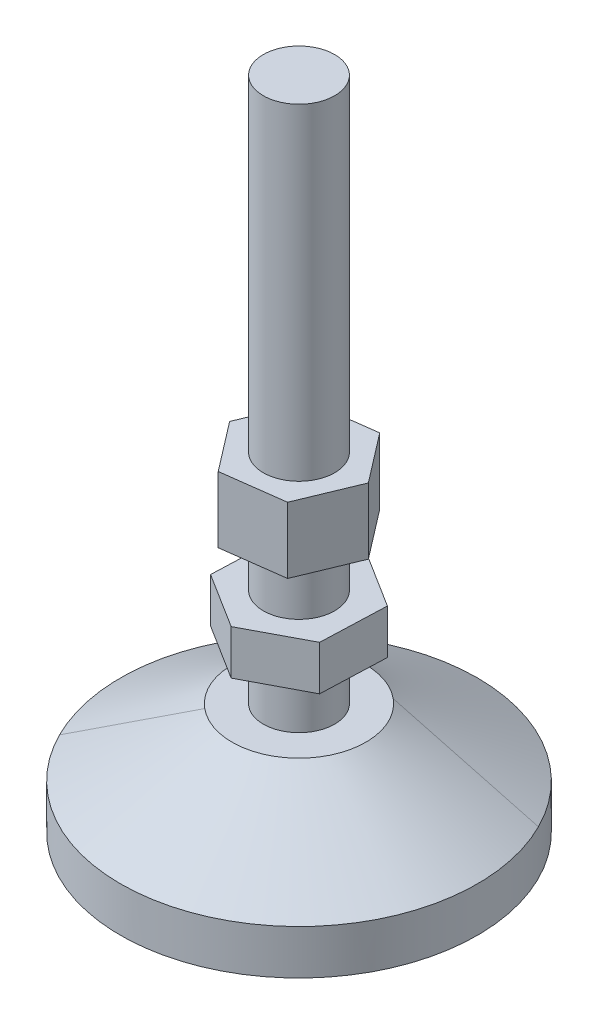
ISO-10303-21;
HEADER;
FILE_DESCRIPTION(('STEP AP214'),'2;1');
FILE_NAME('part.step','',(''),(''),'','','');
FILE_SCHEMA(('AUTOMOTIVE_DESIGN { 1 0 10303 214 1 1 1 1 }'));
ENDSEC;
DATA;
#1=APPLICATION_CONTEXT('core data for automotive mechanical design processes');
#2=APPLICATION_PROTOCOL_DEFINITION('international standard','automotive_design',2000,#1);
#3=PRODUCT_CONTEXT('',#1,'mechanical');
#4=PRODUCT('Part','Part','',(#3));
#5=PRODUCT_RELATED_PRODUCT_CATEGORY('part','',(#4));
#6=PRODUCT_DEFINITION_FORMATION('','',#4);
#7=PRODUCT_DEFINITION_CONTEXT('part definition',#1,'design');
#8=PRODUCT_DEFINITION('design','',#6,#7);
#9=PRODUCT_DEFINITION_SHAPE('','',#8);
#10=(LENGTH_UNIT() NAMED_UNIT(*) SI_UNIT(.MILLI.,.METRE.));
#11=(NAMED_UNIT(*) PLANE_ANGLE_UNIT() SI_UNIT($,.RADIAN.));
#12=(NAMED_UNIT(*) SI_UNIT($,.STERADIAN.) SOLID_ANGLE_UNIT());
#13=UNCERTAINTY_MEASURE_WITH_UNIT(LENGTH_MEASURE(1.E-05),#10,'distance_accuracy_value','');
#14=(GEOMETRIC_REPRESENTATION_CONTEXT(3) GLOBAL_UNCERTAINTY_ASSIGNED_CONTEXT((#13)) GLOBAL_UNIT_ASSIGNED_CONTEXT((#10,
#11,#12)) REPRESENTATION_CONTEXT('',''));
#15=CARTESIAN_POINT('',(0.,0.,0.));
#16=DIRECTION('',(0.,0.,1.));
#17=DIRECTION('',(1.,0.,0.));
#18=AXIS2_PLACEMENT_3D('',#15,#16,#17);
#19=CARTESIAN_POINT('',(0.,147.,0.));
#20=DIRECTION('',(0.,1.,0.));
#21=DIRECTION('',(0.,0.,-1.));
#22=AXIS2_PLACEMENT_3D('',#19,#20,#21);
#23=PLANE('',#22);
#24=CARTESIAN_POINT('',(0.,147.,0.));
#25=DIRECTION('',(0.,1.,0.));
#26=DIRECTION('',(0.,0.,1.));
#27=AXIS2_PLACEMENT_3D('',#24,#25,#26);
#28=CIRCLE('',#27,8.);
#29=CARTESIAN_POINT('',(0.,147.,-8.));
#30=VERTEX_POINT('',#29);
#31=EDGE_CURVE('E119',#30,#30,#28,.T.);
#32=ORIENTED_EDGE('',*,*,#31,.T.);
#33=EDGE_LOOP('',(#32));
#34=FACE_BOUND('',#33,.T.);
#35=ADVANCED_FACE('F16',(#34),#23,.T.);
#36=CARTESIAN_POINT('',(5.29971058692309,73.8,-12.8028538886787));
#37=DIRECTION('',(0.130751284506313,0.,0.991415201416616));
#38=DIRECTION('',(0.,-1.,0.));
#39=AXIS2_PLACEMENT_3D('',#36,#37,#38);
#40=PLANE('',#39);
#41=DIRECTION('',(-0.991415201416616,0.,0.130751284506313));
#42=VECTOR('',#41,1.);
#43=CARTESIAN_POINT('',(5.29971058692309,59.,-12.8028538886787));
#44=LINE('',#43,#42);
#45=CARTESIAN_POINT('',(5.29971058692309,59.,-12.8028538886787));
#46=VERTEX_POINT('',#45);
#47=CARTESIAN_POINT('',(-8.4377414150746,59.,-10.9911109453201));
#48=VERTEX_POINT('',#47);
#49=EDGE_CURVE('E238',#46,#48,#44,.T.);
#50=ORIENTED_EDGE('',*,*,#49,.T.);
#51=DIRECTION('',(0.,-1.,0.));
#52=VECTOR('',#51,1.);
#53=CARTESIAN_POINT('',(-8.4377414150746,73.8,-10.9911109453201));
#54=LINE('',#53,#52);
#55=CARTESIAN_POINT('',(-8.4377414150746,73.8,-10.9911109453201));
#56=VERTEX_POINT('',#55);
#57=EDGE_CURVE('E185',#56,#48,#54,.T.);
#58=ORIENTED_EDGE('',*,*,#57,.F.);
#59=DIRECTION('',(-0.991415201416616,0.,0.130751284506313));
#60=VECTOR('',#59,1.);
#61=CARTESIAN_POINT('',(5.29971058692309,73.8,-12.8028538886787));
#62=LINE('',#61,#60);
#63=CARTESIAN_POINT('',(5.29971058692309,73.8,-12.8028538886787));
#64=VERTEX_POINT('',#63);
#65=EDGE_CURVE('E175',#64,#56,#62,.T.);
#66=ORIENTED_EDGE('',*,*,#65,.F.);
#67=DIRECTION('',(0.,-1.,0.));
#68=VECTOR('',#67,1.);
#69=CARTESIAN_POINT('',(5.29971058692309,73.8,-12.8028538886787));
#70=LINE('',#69,#68);
#71=EDGE_CURVE('E11',#64,#46,#70,.T.);
#72=ORIENTED_EDGE('',*,*,#71,.T.);
#73=EDGE_LOOP('',(#50,#58,#66,#72));
#74=FACE_BOUND('',#73,.T.);
#75=ADVANCED_FACE('F427',(#74),#40,.F.);
#76=CARTESIAN_POINT('',(13.7374520019977,73.8,-1.81174294335863));
#77=DIRECTION('',(-0.793215107871699,0.,0.608941534668222));
#78=DIRECTION('',(0.,1.,0.));
#79=AXIS2_PLACEMENT_3D('',#76,#77,#78);
#80=PLANE('',#79);
#81=DIRECTION('',(-0.608941534668222,0.,-0.793215107871699));
#82=VECTOR('',#81,1.);
#83=CARTESIAN_POINT('',(13.7374520019977,59.,-1.81174294335863));
#84=LINE('',#83,#82);
#85=CARTESIAN_POINT('',(13.7374520019977,59.,-1.81174294335863));
#86=VERTEX_POINT('',#85);
#87=EDGE_CURVE('E234',#86,#46,#84,.T.);
#88=ORIENTED_EDGE('',*,*,#87,.T.);
#89=ORIENTED_EDGE('',*,*,#71,.F.);
#90=DIRECTION('',(-0.608941534668222,0.,-0.793215107871699));
#91=VECTOR('',#90,1.);
#92=CARTESIAN_POINT('',(13.7374520019977,73.8,-1.81174294335863));
#93=LINE('',#92,#91);
#94=CARTESIAN_POINT('',(13.7374520019977,73.8,-1.81174294335863));
#95=VERTEX_POINT('',#94);
#96=EDGE_CURVE('E180',#95,#64,#93,.T.);
#97=ORIENTED_EDGE('',*,*,#96,.F.);
#98=DIRECTION('',(0.,-1.,0.));
#99=VECTOR('',#98,1.);
#100=CARTESIAN_POINT('',(13.7374520019977,73.8,-1.81174294335863));
#101=LINE('',#100,#99);
#102=EDGE_CURVE('E27',#95,#86,#101,.T.);
#103=ORIENTED_EDGE('',*,*,#102,.T.);
#104=EDGE_LOOP('',(#88,#89,#97,#103));
#105=FACE_BOUND('',#104,.T.);
#106=ADVANCED_FACE('F18',(#105),#80,.F.);
#107=CARTESIAN_POINT('',(8.43774141507461,73.8,10.9911109453201));
#108=DIRECTION('',(-0.923966392378012,0.,-0.382473666748394));
#109=DIRECTION('',(-0.382473666748394,0.,0.923966392378012));
#110=AXIS2_PLACEMENT_3D('',#107,#108,#109);
#111=PLANE('',#110);
#112=DIRECTION('',(0.382473666748394,0.,-0.923966392378012));
#113=VECTOR('',#112,1.);
#114=CARTESIAN_POINT('',(8.43774141507461,59.,10.9911109453201));
#115=LINE('',#114,#113);
#116=CARTESIAN_POINT('',(8.43774141507461,59.,10.9911109453201));
#117=VERTEX_POINT('',#116);
#118=EDGE_CURVE('E209',#117,#86,#115,.T.);
#119=ORIENTED_EDGE('',*,*,#118,.T.);
#120=ORIENTED_EDGE('',*,*,#102,.F.);
#121=DIRECTION('',(0.382473666748394,0.,-0.923966392378012));
#122=VECTOR('',#121,1.);
#123=CARTESIAN_POINT('',(8.43774141507461,73.8,10.9911109453201));
#124=LINE('',#123,#122);
#125=CARTESIAN_POINT('',(8.43774141507461,73.8,10.9911109453201));
#126=VERTEX_POINT('',#125);
#127=EDGE_CURVE('E173',#126,#95,#124,.T.);
#128=ORIENTED_EDGE('',*,*,#127,.F.);
#129=DIRECTION('',(0.,-1.,0.));
#130=VECTOR('',#129,1.);
#131=CARTESIAN_POINT('',(8.43774141507461,73.8,10.9911109453201));
#132=LINE('',#131,#130);
#133=EDGE_CURVE('E233',#126,#117,#132,.T.);
#134=ORIENTED_EDGE('',*,*,#133,.T.);
#135=EDGE_LOOP('',(#119,#120,#128,#134));
#136=FACE_BOUND('',#135,.T.);
#137=ADVANCED_FACE('F616',(#136),#111,.F.);
#138=CARTESIAN_POINT('',(-5.29971058692308,73.8,12.8028538886787));
#139=DIRECTION('',(-0.130751284506313,0.,-0.991415201416616));
#140=DIRECTION('',(-0.991415201416616,0.,0.130751284506313));
#141=AXIS2_PLACEMENT_3D('',#138,#139,#140);
#142=PLANE('',#141);
#143=DIRECTION('',(0.991415201416616,0.,-0.130751284506313));
#144=VECTOR('',#143,1.);
#145=CARTESIAN_POINT('',(-5.29971058692308,59.,12.8028538886787));
#146=LINE('',#145,#144);
#147=CARTESIAN_POINT('',(-5.29971058692308,59.,12.8028538886787));
#148=VERTEX_POINT('',#147);
#149=EDGE_CURVE('E220',#148,#117,#146,.T.);
#150=ORIENTED_EDGE('',*,*,#149,.T.);
#151=ORIENTED_EDGE('',*,*,#133,.F.);
#152=DIRECTION('',(0.991415201416616,0.,-0.130751284506313));
#153=VECTOR('',#152,1.);
#154=CARTESIAN_POINT('',(-5.29971058692308,73.8,12.8028538886787));
#155=LINE('',#154,#153);
#156=CARTESIAN_POINT('',(-5.29971058692308,73.8,12.8028538886787));
#157=VERTEX_POINT('',#156);
#158=EDGE_CURVE('E169',#157,#126,#155,.T.);
#159=ORIENTED_EDGE('',*,*,#158,.F.);
#160=DIRECTION('',(0.,-1.,0.));
#161=VECTOR('',#160,1.);
#162=CARTESIAN_POINT('',(-5.29971058692308,73.8,12.8028538886787));
#163=LINE('',#162,#161);
#164=EDGE_CURVE('E42',#157,#148,#163,.T.);
#165=ORIENTED_EDGE('',*,*,#164,.T.);
#166=EDGE_LOOP('',(#150,#151,#159,#165));
#167=FACE_BOUND('',#166,.T.);
#168=ADVANCED_FACE('F620',(#167),#142,.F.);
#169=CARTESIAN_POINT('',(-13.7374520019977,73.8,1.81174294335863));
#170=DIRECTION('',(0.793215107871699,0.,-0.608941534668222));
#171=DIRECTION('',(0.,-1.,0.));
#172=AXIS2_PLACEMENT_3D('',#169,#170,#171);
#173=PLANE('',#172);
#174=DIRECTION('',(0.608941534668222,0.,0.793215107871699));
#175=VECTOR('',#174,1.);
#176=CARTESIAN_POINT('',(-13.7374520019977,59.,1.81174294335863));
#177=LINE('',#176,#175);
#178=CARTESIAN_POINT('',(-13.7374520019977,59.,1.81174294335863));
#179=VERTEX_POINT('',#178);
#180=EDGE_CURVE('E212',#179,#148,#177,.T.);
#181=ORIENTED_EDGE('',*,*,#180,.T.);
#182=ORIENTED_EDGE('',*,*,#164,.F.);
#183=DIRECTION('',(0.608941534668222,0.,0.793215107871699));
#184=VECTOR('',#183,1.);
#185=CARTESIAN_POINT('',(-13.7374520019977,73.8,1.81174294335863));
#186=LINE('',#185,#184);
#187=CARTESIAN_POINT('',(-13.7374520019977,73.8,1.81174294335863));
#188=VERTEX_POINT('',#187);
#189=EDGE_CURVE('E174',#188,#157,#186,.T.);
#190=ORIENTED_EDGE('',*,*,#189,.F.);
#191=DIRECTION('',(0.,-1.,0.));
#192=VECTOR('',#191,1.);
#193=CARTESIAN_POINT('',(-13.7374520019977,73.8,1.81174294335863));
#194=LINE('',#193,#192);
#195=EDGE_CURVE('E188',#188,#179,#194,.T.);
#196=ORIENTED_EDGE('',*,*,#195,.T.);
#197=EDGE_LOOP('',(#181,#182,#190,#196));
#198=FACE_BOUND('',#197,.T.);
#199=ADVANCED_FACE('F630',(#198),#173,.F.);
#200=CARTESIAN_POINT('',(-8.4377414150746,73.8,-10.9911109453201));
#201=DIRECTION('',(0.923966392378012,0.,0.382473666748394));
#202=DIRECTION('',(0.,-1.,0.));
#203=AXIS2_PLACEMENT_3D('',#200,#201,#202);
#204=PLANE('',#203);
#205=DIRECTION('',(-0.382473666748394,0.,0.923966392378012));
#206=VECTOR('',#205,1.);
#207=CARTESIAN_POINT('',(-8.4377414150746,59.,-10.9911109453201));
#208=LINE('',#207,#206);
#209=EDGE_CURVE('E179',#48,#179,#208,.T.);
#210=ORIENTED_EDGE('',*,*,#209,.T.);
#211=ORIENTED_EDGE('',*,*,#195,.F.);
#212=DIRECTION('',(-0.382473666748394,0.,0.923966392378012));
#213=VECTOR('',#212,1.);
#214=CARTESIAN_POINT('',(-8.4377414150746,73.8,-10.9911109453201));
#215=LINE('',#214,#213);
#216=EDGE_CURVE('E239',#56,#188,#215,.T.);
#217=ORIENTED_EDGE('',*,*,#216,.F.);
#218=ORIENTED_EDGE('',*,*,#57,.T.);
#219=EDGE_LOOP('',(#210,#211,#217,#218));
#220=FACE_BOUND('',#219,.T.);
#221=ADVANCED_FACE('F603',(#220),#204,.F.);
#222=CARTESIAN_POINT('',(0.,59.,0.));
#223=DIRECTION('',(0.,1.,0.));
#224=DIRECTION('',(1.,0.,0.));
#225=AXIS2_PLACEMENT_3D('',#222,#223,#224);
#226=PLANE('',#225);
#227=CARTESIAN_POINT('',(0.,59.,0.));
#228=DIRECTION('',(0.,1.,0.));
#229=DIRECTION('',(0.,0.,1.));
#230=AXIS2_PLACEMENT_3D('',#227,#228,#229);
#231=CIRCLE('',#230,8.);
#232=CARTESIAN_POINT('',(0.,59.,-8.));
#233=VERTEX_POINT('',#232);
#234=EDGE_CURVE('E144',#233,#233,#231,.T.);
#235=ORIENTED_EDGE('',*,*,#234,.T.);
#236=EDGE_LOOP('',(#235));
#237=FACE_BOUND('',#236,.T.);
#238=ORIENTED_EDGE('',*,*,#209,.F.);
#239=ORIENTED_EDGE('',*,*,#49,.F.);
#240=ORIENTED_EDGE('',*,*,#87,.F.);
#241=ORIENTED_EDGE('',*,*,#118,.F.);
#242=ORIENTED_EDGE('',*,*,#149,.F.);
#243=ORIENTED_EDGE('',*,*,#180,.F.);
#244=EDGE_LOOP('',(#238,#239,#240,#241,#242,#243));
#245=FACE_BOUND('',#244,.T.);
#246=ADVANCED_FACE('F599',(#237,#245),#226,.F.);
#247=CARTESIAN_POINT('',(0.,73.8,0.));
#248=DIRECTION('',(0.,1.,0.));
#249=DIRECTION('',(1.,0.,0.));
#250=AXIS2_PLACEMENT_3D('',#247,#248,#249);
#251=PLANE('',#250);
#252=CARTESIAN_POINT('',(0.,73.8,0.));
#253=DIRECTION('',(0.,1.,0.));
#254=DIRECTION('',(0.,0.,1.));
#255=AXIS2_PLACEMENT_3D('',#252,#253,#254);
#256=CIRCLE('',#255,8.);
#257=CARTESIAN_POINT('',(0.,73.8,-8.));
#258=VERTEX_POINT('',#257);
#259=EDGE_CURVE('E113',#258,#258,#256,.T.);
#260=ORIENTED_EDGE('',*,*,#259,.F.);
#261=EDGE_LOOP('',(#260));
#262=FACE_BOUND('',#261,.T.);
#263=ORIENTED_EDGE('',*,*,#216,.T.);
#264=ORIENTED_EDGE('',*,*,#189,.T.);
#265=ORIENTED_EDGE('',*,*,#158,.T.);
#266=ORIENTED_EDGE('',*,*,#127,.T.);
#267=ORIENTED_EDGE('',*,*,#96,.T.);
#268=ORIENTED_EDGE('',*,*,#65,.T.);
#269=EDGE_LOOP('',(#263,#264,#265,#266,#267,#268));
#270=FACE_BOUND('',#269,.T.);
#271=ADVANCED_FACE('F443',(#262,#270),#251,.T.);
#272=CARTESIAN_POINT('',(0.,37.,0.));
#273=DIRECTION('',(0.,1.,0.));
#274=DIRECTION('',(1.,0.,0.));
#275=AXIS2_PLACEMENT_3D('',#272,#273,#274);
#276=PLANE('',#275);
#277=CARTESIAN_POINT('',(0.,37.,0.));
#278=DIRECTION('',(0.,1.,0.));
#279=DIRECTION('',(0.,0.,1.));
#280=AXIS2_PLACEMENT_3D('',#277,#278,#279);
#281=CIRCLE('',#280,8.);
#282=CARTESIAN_POINT('',(0.,37.,-8.));
#283=VERTEX_POINT('',#282);
#284=EDGE_CURVE('E145',#283,#283,#281,.T.);
#285=ORIENTED_EDGE('',*,*,#284,.T.);
#286=EDGE_LOOP('',(#285));
#287=FACE_BOUND('',#286,.T.);
#288=DIRECTION('',(-0.884080626307763,0.,0.467334405096901));
#289=VECTOR('',#288,1.);
#290=CARTESIAN_POINT('',(0.547240237587684,37.,-14.6544826403288));
#291=LINE('',#290,#289);
#292=CARTESIAN_POINT('',(0.547240237587684,37.,-14.6544826403288));
#293=VERTEX_POINT('',#292);
#294=CARTESIAN_POINT('',(-12.417534127049,37.,-7.80116526788837));
#295=VERTEX_POINT('',#294);
#296=EDGE_CURVE('E155',#293,#295,#291,.T.);
#297=ORIENTED_EDGE('',*,*,#296,.F.);
#298=DIRECTION('',(-0.846763780030285,0.,-0.53196907882773));
#299=VECTOR('',#298,1.);
#300=CARTESIAN_POINT('',(12.9647743646366,37.,-6.85331737244044));
#301=LINE('',#300,#299);
#302=CARTESIAN_POINT('',(12.9647743646366,37.,-6.85331737244044));
#303=VERTEX_POINT('',#302);
#304=EDGE_CURVE('E272',#303,#293,#301,.T.);
#305=ORIENTED_EDGE('',*,*,#304,.F.);
#306=DIRECTION('',(0.0373168462774775,0.,-0.99930348392463));
#307=VECTOR('',#306,1.);
#308=CARTESIAN_POINT('',(12.417534127049,37.,7.80116526788837));
#309=LINE('',#308,#307);
#310=CARTESIAN_POINT('',(12.417534127049,37.,7.80116526788837));
#311=VERTEX_POINT('',#310);
#312=EDGE_CURVE('E162',#311,#303,#309,.T.);
#313=ORIENTED_EDGE('',*,*,#312,.F.);
#314=DIRECTION('',(0.884080626307763,0.,-0.467334405096901));
#315=VECTOR('',#314,1.);
#316=CARTESIAN_POINT('',(-0.547240237587677,37.,14.6544826403288));
#317=LINE('',#316,#315);
#318=CARTESIAN_POINT('',(-0.547240237587677,37.,14.6544826403288));
#319=VERTEX_POINT('',#318);
#320=EDGE_CURVE('E326',#319,#311,#317,.T.);
#321=ORIENTED_EDGE('',*,*,#320,.F.);
#322=DIRECTION('',(0.846763780030285,0.,0.531969078827729));
#323=VECTOR('',#322,1.);
#324=CARTESIAN_POINT('',(-12.9647743646366,37.,6.85331737244044));
#325=LINE('',#324,#323);
#326=CARTESIAN_POINT('',(-12.9647743646366,37.,6.85331737244044));
#327=VERTEX_POINT('',#326);
#328=EDGE_CURVE('E146',#327,#319,#325,.T.);
#329=ORIENTED_EDGE('',*,*,#328,.F.);
#330=DIRECTION('',(-0.0373168462774774,0.,0.99930348392463));
#331=VECTOR('',#330,1.);
#332=CARTESIAN_POINT('',(-12.417534127049,37.,-7.80116526788837));
#333=LINE('',#332,#331);
#334=EDGE_CURVE('E191',#295,#327,#333,.T.);
#335=ORIENTED_EDGE('',*,*,#334,.F.);
#336=EDGE_LOOP('',(#297,#305,#313,#321,#329,#335));
#337=FACE_BOUND('',#336,.T.);
#338=ADVANCED_FACE('F410',(#287,#337),#276,.F.);
#339=CARTESIAN_POINT('',(0.,47.,0.));
#340=DIRECTION('',(0.,1.,0.));
#341=DIRECTION('',(1.,0.,0.));
#342=AXIS2_PLACEMENT_3D('',#339,#340,#341);
#343=PLANE('',#342);
#344=CARTESIAN_POINT('',(0.,47.,0.));
#345=DIRECTION('',(0.,1.,0.));
#346=DIRECTION('',(0.,0.,1.));
#347=AXIS2_PLACEMENT_3D('',#344,#345,#346);
#348=CIRCLE('',#347,8.);
#349=CARTESIAN_POINT('',(0.,47.,-8.));
#350=VERTEX_POINT('',#349);
#351=EDGE_CURVE('E168',#350,#350,#348,.T.);
#352=ORIENTED_EDGE('',*,*,#351,.F.);
#353=EDGE_LOOP('',(#352));
#354=FACE_BOUND('',#353,.T.);
#355=DIRECTION('',(-0.884080626307763,0.,0.467334405096901));
#356=VECTOR('',#355,1.);
#357=CARTESIAN_POINT('',(0.547240237587684,47.,-14.6544826403288));
#358=LINE('',#357,#356);
#359=CARTESIAN_POINT('',(0.547240237587684,47.,-14.6544826403288));
#360=VERTEX_POINT('',#359);
#361=CARTESIAN_POINT('',(-12.417534127049,47.,-7.80116526788837));
#362=VERTEX_POINT('',#361);
#363=EDGE_CURVE('E136',#360,#362,#358,.T.);
#364=ORIENTED_EDGE('',*,*,#363,.T.);
#365=DIRECTION('',(-0.0373168462774774,0.,0.99930348392463));
#366=VECTOR('',#365,1.);
#367=CARTESIAN_POINT('',(-12.417534127049,47.,-7.80116526788837));
#368=LINE('',#367,#366);
#369=CARTESIAN_POINT('',(-12.9647743646366,47.,6.85331737244044));
#370=VERTEX_POINT('',#369);
#371=EDGE_CURVE('E151',#362,#370,#368,.T.);
#372=ORIENTED_EDGE('',*,*,#371,.T.);
#373=DIRECTION('',(0.846763780030285,0.,0.531969078827729));
#374=VECTOR('',#373,1.);
#375=CARTESIAN_POINT('',(-12.9647743646366,47.,6.85331737244044));
#376=LINE('',#375,#374);
#377=CARTESIAN_POINT('',(-0.547240237587677,47.,14.6544826403288));
#378=VERTEX_POINT('',#377);
#379=EDGE_CURVE('E20',#370,#378,#376,.T.);
#380=ORIENTED_EDGE('',*,*,#379,.T.);
#381=DIRECTION('',(0.884080626307763,0.,-0.467334405096901));
#382=VECTOR('',#381,1.);
#383=CARTESIAN_POINT('',(-0.547240237587677,47.,14.6544826403288));
#384=LINE('',#383,#382);
#385=CARTESIAN_POINT('',(12.417534127049,47.,7.80116526788837));
#386=VERTEX_POINT('',#385);
#387=EDGE_CURVE('E159',#378,#386,#384,.T.);
#388=ORIENTED_EDGE('',*,*,#387,.T.);
#389=DIRECTION('',(0.0373168462774775,0.,-0.99930348392463));
#390=VECTOR('',#389,1.);
#391=CARTESIAN_POINT('',(12.417534127049,47.,7.80116526788837));
#392=LINE('',#391,#390);
#393=CARTESIAN_POINT('',(12.9647743646366,47.,-6.85331737244044));
#394=VERTEX_POINT('',#393);
#395=EDGE_CURVE('E280',#386,#394,#392,.T.);
#396=ORIENTED_EDGE('',*,*,#395,.T.);
#397=DIRECTION('',(-0.846763780030285,0.,-0.53196907882773));
#398=VECTOR('',#397,1.);
#399=CARTESIAN_POINT('',(12.9647743646366,47.,-6.85331737244044));
#400=LINE('',#399,#398);
#401=EDGE_CURVE('E242',#394,#360,#400,.T.);
#402=ORIENTED_EDGE('',*,*,#401,.T.);
#403=EDGE_LOOP('',(#364,#372,#380,#388,#396,#402));
#404=FACE_BOUND('',#403,.T.);
#405=ADVANCED_FACE('F341',(#354,#404),#343,.T.);
#406=CARTESIAN_POINT('',(12.9647743646366,47.,-6.85331737244044));
#407=DIRECTION('',(-0.53196907882773,0.,0.846763780030285));
#408=DIRECTION('',(0.,1.,0.));
#409=AXIS2_PLACEMENT_3D('',#406,#407,#408);
#410=PLANE('',#409);
#411=ORIENTED_EDGE('',*,*,#304,.T.);
#412=DIRECTION('',(0.,-1.,0.));
#413=VECTOR('',#412,1.);
#414=CARTESIAN_POINT('',(0.547240237587684,47.,-14.6544826403288));
#415=LINE('',#414,#413);
#416=EDGE_CURVE('E139',#360,#293,#415,.T.);
#417=ORIENTED_EDGE('',*,*,#416,.F.);
#418=ORIENTED_EDGE('',*,*,#401,.F.);
#419=DIRECTION('',(0.,-1.,0.));
#420=VECTOR('',#419,1.);
#421=CARTESIAN_POINT('',(12.9647743646366,47.,-6.85331737244044));
#422=LINE('',#421,#420);
#423=EDGE_CURVE('E284',#394,#303,#422,.T.);
#424=ORIENTED_EDGE('',*,*,#423,.T.);
#425=EDGE_LOOP('',(#411,#417,#418,#424));
#426=FACE_BOUND('',#425,.T.);
#427=ADVANCED_FACE('F409',(#426),#410,.F.);
#428=CARTESIAN_POINT('',(12.417534127049,47.,7.80116526788837));
#429=DIRECTION('',(-0.99930348392463,0.,-0.0373168462774775));
#430=DIRECTION('',(-0.0373168462774775,0.,0.99930348392463));
#431=AXIS2_PLACEMENT_3D('',#428,#429,#430);
#432=PLANE('',#431);
#433=ORIENTED_EDGE('',*,*,#312,.T.);
#434=ORIENTED_EDGE('',*,*,#423,.F.);
#435=ORIENTED_EDGE('',*,*,#395,.F.);
#436=DIRECTION('',(0.,-1.,0.));
#437=VECTOR('',#436,1.);
#438=CARTESIAN_POINT('',(12.417534127049,47.,7.80116526788837));
#439=LINE('',#438,#437);
#440=EDGE_CURVE('E163',#386,#311,#439,.T.);
#441=ORIENTED_EDGE('',*,*,#440,.T.);
#442=EDGE_LOOP('',(#433,#434,#435,#441));
#443=FACE_BOUND('',#442,.T.);
#444=ADVANCED_FACE('F414',(#443),#432,.F.);
#445=CARTESIAN_POINT('',(-0.547240237587677,47.,14.6544826403288));
#446=DIRECTION('',(-0.467334405096901,0.,-0.884080626307763));
#447=DIRECTION('',(-0.884080626307763,0.,0.467334405096901));
#448=AXIS2_PLACEMENT_3D('',#445,#446,#447);
#449=PLANE('',#448);
#450=ORIENTED_EDGE('',*,*,#320,.T.);
#451=ORIENTED_EDGE('',*,*,#440,.F.);
#452=ORIENTED_EDGE('',*,*,#387,.F.);
#453=DIRECTION('',(0.,-1.,0.));
#454=VECTOR('',#453,1.);
#455=CARTESIAN_POINT('',(-0.547240237587677,47.,14.6544826403288));
#456=LINE('',#455,#454);
#457=EDGE_CURVE('E150',#378,#319,#456,.T.);
#458=ORIENTED_EDGE('',*,*,#457,.T.);
#459=EDGE_LOOP('',(#450,#451,#452,#458));
#460=FACE_BOUND('',#459,.T.);
#461=ADVANCED_FACE('F345',(#460),#449,.F.);
#462=CARTESIAN_POINT('',(-12.9647743646366,47.,6.85331737244044));
#463=DIRECTION('',(0.531969078827729,0.,-0.846763780030285));
#464=DIRECTION('',(0.,-1.,0.));
#465=AXIS2_PLACEMENT_3D('',#462,#463,#464);
#466=PLANE('',#465);
#467=ORIENTED_EDGE('',*,*,#328,.T.);
#468=ORIENTED_EDGE('',*,*,#457,.F.);
#469=ORIENTED_EDGE('',*,*,#379,.F.);
#470=DIRECTION('',(0.,-1.,0.));
#471=VECTOR('',#470,1.);
#472=CARTESIAN_POINT('',(-12.9647743646366,47.,6.85331737244044));
#473=LINE('',#472,#471);
#474=EDGE_CURVE('E184',#370,#327,#473,.T.);
#475=ORIENTED_EDGE('',*,*,#474,.T.);
#476=EDGE_LOOP('',(#467,#468,#469,#475));
#477=FACE_BOUND('',#476,.T.);
#478=ADVANCED_FACE('F344',(#477),#466,.F.);
#479=CARTESIAN_POINT('',(-12.417534127049,47.,-7.80116526788837));
#480=DIRECTION('',(0.99930348392463,0.,0.0373168462774774));
#481=DIRECTION('',(0.,-1.,0.));
#482=AXIS2_PLACEMENT_3D('',#479,#480,#481);
#483=PLANE('',#482);
#484=ORIENTED_EDGE('',*,*,#334,.T.);
#485=ORIENTED_EDGE('',*,*,#474,.F.);
#486=ORIENTED_EDGE('',*,*,#371,.F.);
#487=DIRECTION('',(0.,-1.,0.));
#488=VECTOR('',#487,1.);
#489=CARTESIAN_POINT('',(-12.417534127049,47.,-7.80116526788837));
#490=LINE('',#489,#488);
#491=EDGE_CURVE('E140',#362,#295,#490,.T.);
#492=ORIENTED_EDGE('',*,*,#491,.T.);
#493=EDGE_LOOP('',(#484,#485,#486,#492));
#494=FACE_BOUND('',#493,.T.);
#495=ADVANCED_FACE('F413',(#494),#483,.F.);
#496=CARTESIAN_POINT('',(0.547240237587684,47.,-14.6544826403288));
#497=DIRECTION('',(0.467334405096901,0.,0.884080626307763));
#498=DIRECTION('',(0.,-1.,0.));
#499=AXIS2_PLACEMENT_3D('',#496,#497,#498);
#500=PLANE('',#499);
#501=ORIENTED_EDGE('',*,*,#296,.T.);
#502=ORIENTED_EDGE('',*,*,#491,.F.);
#503=ORIENTED_EDGE('',*,*,#363,.F.);
#504=ORIENTED_EDGE('',*,*,#416,.T.);
#505=EDGE_LOOP('',(#501,#502,#503,#504));
#506=FACE_BOUND('',#505,.T.);
#507=ADVANCED_FACE('F412',(#506),#500,.F.);
#508=CARTESIAN_POINT('',(9.59513522117862,25.,-11.529673893363));
#509=CARTESIAN_POINT('',(35.7610540048334,10.,-17.9205752269115));
#510=CARTESIAN_POINT('',(9.59596431310563,25.,-11.5289839129504));
#511=CARTESIAN_POINT('',(35.762342662638,10.,-17.9180036709897));
#512=CARTESIAN_POINT('',(9.59679330080092,25.,-11.5282938679148));
#513=CARTESIAN_POINT('',(35.7636309967342,10.,-17.9154320685208));
#514=CARTESIAN_POINT('',(9.59762218426767,25.,-11.5276037582861));
#515=CARTESIAN_POINT('',(35.7649190071616,10.,-17.9128604195748));
#516=CARTESIAN_POINT('',(32.65282970084,25.,7.66764061024918));
#517=CARTESIAN_POINT('',(71.5906398463112,10.,53.6169775947483));
#518=CARTESIAN_POINT('',(13.4575853323046,25.,30.7228481268215));
#519=CARTESIAN_POINT('',(0.0608018319881026,10.,89.442698433898));
#520=CARTESIAN_POINT('',(-9.59762218426767,25.,11.5276037582861));
#521=CARTESIAN_POINT('',(-35.7649190071616,10.,17.9128604195748));
#522=CARTESIAN_POINT('',(-9.59845106773245,25.,11.5269136486592));
#523=CARTESIAN_POINT('',(-35.7662070175859,10.,17.910288770635));
#524=CARTESIAN_POINT('',(-9.59927990656034,25.,11.5262234248245));
#525=CARTESIAN_POINT('',(-35.7674947969417,10.,17.9077168903321));
#526=CARTESIAN_POINT('',(-9.60010870072246,25.,11.5255330867736));
#527=CARTESIAN_POINT('',(-35.7687823451491,10.,17.9051447786762));
#528=(BOUNDED_SURFACE() B_SPLINE_SURFACE(3,1,((#508,#509),(#510,#511),(#512,#513),(#514,#515),
(#516,#517),(#518,#519),(#520,#521),(#522,#523),(#524,#525),(#526,#527)),.UNSPECIFIED.,.F.,.F.,
.F.) B_SPLINE_SURFACE_WITH_KNOTS((4,3,3,4),(2,2),(0.499946075705225,0.5,1.,1.00005392429465),
(0.,1.),
.UNSPECIFIED.) GEOMETRIC_REPRESENTATION_ITEM() RATIONAL_B_SPLINE_SURFACE(((0.999784326083537,
0.999784326083537),(0.999856209634813,0.999856209634813),(0.9999281009403,0.9999281009403),(1.,
1.),(0.333333333333334,0.333333333333334),(0.333333333333334,0.333333333333334),(1.,1.),
(0.999928100940472,0.999928100940472),(0.999856209635156,0.999856209635156),(0.999784326084052,0.999784326084052))) REPRESENTATION_ITEM('') SURFACE());
#529=CARTESIAN_POINT('',(9.59762147793056,25.,-11.5276029099362));
#530=CARTESIAN_POINT('',(35.7649190071616,10.,-17.9128604195748));
#531=(BOUNDED_CURVE() B_SPLINE_CURVE(1,(#529,#530),.UNSPECIFIED.,.F.,
.F.) B_SPLINE_CURVE_WITH_KNOTS((2,2),(0.,1.),
.UNSPECIFIED.) CURVE() GEOMETRIC_REPRESENTATION_ITEM() RATIONAL_B_SPLINE_CURVE((1.,1.)) REPRESENTATION_ITEM(''));
#532=CARTESIAN_POINT('',(9.59762147793056,25.,-11.5276029099362));
#533=VERTEX_POINT('',#532);
#534=CARTESIAN_POINT('',(35.7649190071616,10.,-17.9128604195748));
#535=VERTEX_POINT('',#534);
#536=EDGE_CURVE('E127',#533,#535,#531,.T.);
#537=CARTESIAN_POINT('',(0.,25.,0.));
#538=DIRECTION('',(0.,1.,0.));
#539=DIRECTION('',(0.,0.,1.));
#540=AXIS2_PLACEMENT_3D('',#537,#538,#539);
#541=CIRCLE('',#540,15.);
#542=CARTESIAN_POINT('',(-9.59762147793648,25.,11.5276029099312));
#543=VERTEX_POINT('',#542);
#544=EDGE_CURVE('E165',#543,#533,#541,.T.);
#545=CARTESIAN_POINT('',(-9.59762147793648,25.,11.5276029099312));
#546=CARTESIAN_POINT('',(-35.7649190071616,10.,17.9128604195748));
#547=(BOUNDED_CURVE() B_SPLINE_CURVE(1,(#545,#546),.UNSPECIFIED.,.F.,
.F.) B_SPLINE_CURVE_WITH_KNOTS((2,2),(0.,1.),
.UNSPECIFIED.) CURVE() GEOMETRIC_REPRESENTATION_ITEM() RATIONAL_B_SPLINE_CURVE((1.,1.)) REPRESENTATION_ITEM(''));
#548=CARTESIAN_POINT('',(-35.7649190071616,10.,17.9128604195748));
#549=VERTEX_POINT('',#548);
#550=EDGE_CURVE('E275',#543,#549,#547,.T.);
#551=CARTESIAN_POINT('',(0.,10.,0.));
#552=DIRECTION('',(0.,1.,0.));
#553=DIRECTION('',(0.,0.,-1.));
#554=AXIS2_PLACEMENT_3D('',#551,#552,#553);
#555=CIRCLE('',#554,40.);
#556=EDGE_CURVE('E268',#549,#535,#555,.T.);
#557=ORIENTED_EDGE('',*,*,#536,.F.);
#558=ORIENTED_EDGE('',*,*,#544,.F.);
#559=ORIENTED_EDGE('',*,*,#550,.T.);
#560=ORIENTED_EDGE('',*,*,#556,.T.);
#561=EDGE_LOOP('',(#557,#558,#559,#560));
#562=FACE_BOUND('',#561,.T.);
#563=ADVANCED_FACE('F572',(#562),#528,.T.);
#564=CARTESIAN_POINT('',(0.,25.,0.));
#565=DIRECTION('',(0.,1.,0.));
#566=DIRECTION('',(1.,0.,0.));
#567=AXIS2_PLACEMENT_3D('',#564,#565,#566);
#568=PLANE('',#567);
#569=CARTESIAN_POINT('',(0.,25.,0.));
#570=DIRECTION('',(0.,1.,0.));
#571=DIRECTION('',(0.,0.,1.));
#572=AXIS2_PLACEMENT_3D('',#569,#570,#571);
#573=CIRCLE('',#572,8.);
#574=CARTESIAN_POINT('',(0.,25.,-8.));
#575=VERTEX_POINT('',#574);
#576=EDGE_CURVE('E141',#575,#575,#573,.T.);
#577=ORIENTED_EDGE('',*,*,#576,.F.);
#578=EDGE_LOOP('',(#577));
#579=FACE_BOUND('',#578,.T.);
#580=ORIENTED_EDGE('',*,*,#544,.T.);
#581=CARTESIAN_POINT('',(0.,25.,0.));
#582=DIRECTION('',(0.,1.,0.));
#583=DIRECTION('',(0.,0.,1.));
#584=AXIS2_PLACEMENT_3D('',#581,#582,#583);
#585=CIRCLE('',#584,15.);
#586=EDGE_CURVE('E118',#533,#543,#585,.T.);
#587=ORIENTED_EDGE('',*,*,#586,.T.);
#588=EDGE_LOOP('',(#580,#587));
#589=FACE_BOUND('',#588,.T.);
#590=ADVANCED_FACE('F568',(#579,#589),#568,.T.);
#591=CARTESIAN_POINT('',(0.,0.,0.));
#592=DIRECTION('',(0.,1.,0.));
#593=DIRECTION('',(1.,0.,0.));
#594=AXIS2_PLACEMENT_3D('',#591,#592,#593);
#595=PLANE('',#594);
#596=CARTESIAN_POINT('',(0.,0.,0.));
#597=DIRECTION('',(0.,1.,0.));
#598=DIRECTION('',(0.,0.,1.));
#599=AXIS2_PLACEMENT_3D('',#596,#597,#598);
#600=CIRCLE('',#599,40.);
#601=CARTESIAN_POINT('',(0.,0.,-40.));
#602=VERTEX_POINT('',#601);
#603=EDGE_CURVE('E265',#602,#602,#600,.T.);
#604=ORIENTED_EDGE('',*,*,#603,.F.);
#605=EDGE_LOOP('',(#604));
#606=FACE_BOUND('',#605,.T.);
#607=ADVANCED_FACE('F454',(#606),#595,.F.);
#608=CARTESIAN_POINT('',(0.,69.6274169979695,0.));
#609=DIRECTION('',(0.,-1.,0.));
#610=DIRECTION('',(0.,0.,-1.));
#611=AXIS2_PLACEMENT_3D('',#608,#609,#610);
#612=CYLINDRICAL_SURFACE('',#611,8.);
#613=ORIENTED_EDGE('',*,*,#351,.T.);
#614=EDGE_LOOP('',(#613));
#615=FACE_BOUND('',#614,.T.);
#616=ORIENTED_EDGE('',*,*,#234,.F.);
#617=EDGE_LOOP('',(#616));
#618=FACE_BOUND('',#617,.T.);
#619=ADVANCED_FACE('F447',(#615,#618),#612,.T.);
#620=CARTESIAN_POINT('',(0.,69.6274169979695,0.));
#621=DIRECTION('',(0.,-1.,0.));
#622=DIRECTION('',(0.,0.,-1.));
#623=AXIS2_PLACEMENT_3D('',#620,#621,#622);
#624=CYLINDRICAL_SURFACE('',#623,8.);
#625=ORIENTED_EDGE('',*,*,#576,.T.);
#626=EDGE_LOOP('',(#625));
#627=FACE_BOUND('',#626,.T.);
#628=ORIENTED_EDGE('',*,*,#284,.F.);
#629=EDGE_LOOP('',(#628));
#630=FACE_BOUND('',#629,.T.);
#631=ADVANCED_FACE('F445',(#627,#630),#624,.T.);
#632=CARTESIAN_POINT('',(0.,10.,0.));
#633=DIRECTION('',(0.,-1.,0.));
#634=DIRECTION('',(0.,0.,-1.));
#635=AXIS2_PLACEMENT_3D('',#632,#633,#634);
#636=CYLINDRICAL_SURFACE('',#635,40.);
#637=ORIENTED_EDGE('',*,*,#603,.T.);
#638=EDGE_LOOP('',(#637));
#639=FACE_BOUND('',#638,.T.);
#640=CARTESIAN_POINT('',(0.,10.,0.));
#641=DIRECTION('',(0.,1.,0.));
#642=DIRECTION('',(0.,0.,-1.));
#643=AXIS2_PLACEMENT_3D('',#640,#641,#642);
#644=CIRCLE('',#643,40.);
#645=EDGE_CURVE('E292',#535,#549,#644,.T.);
#646=ORIENTED_EDGE('',*,*,#645,.F.);
#647=ORIENTED_EDGE('',*,*,#556,.F.);
#648=EDGE_LOOP('',(#646,#647));
#649=FACE_BOUND('',#648,.T.);
#650=ADVANCED_FACE('F437',(#639,#649),#636,.T.);
#651=CARTESIAN_POINT('',(-9.5951352211764,25.,11.5296738933649));
#652=CARTESIAN_POINT('',(-35.7610540048299,10.,17.9205752269183));
#653=CARTESIAN_POINT('',(-9.59596431310416,25.,11.5289839129517));
#654=CARTESIAN_POINT('',(-35.7623426626357,10.,17.9180036709943));
#655=CARTESIAN_POINT('',(-9.59679330080018,25.,11.5282938679154));
#656=CARTESIAN_POINT('',(-35.763630996733,10.,17.9154320685231));
#657=CARTESIAN_POINT('',(-9.59762218426767,25.,11.5276037582861));
#658=CARTESIAN_POINT('',(-35.7649190071616,10.,17.9128604195748));
#659=CARTESIAN_POINT('',(-32.65282970084,25.,-7.66764061024918));
#660=CARTESIAN_POINT('',(-71.5906398463112,10.,-53.6169775947483));
#661=CARTESIAN_POINT('',(-13.4575853323046,25.,-30.7228481268215));
#662=CARTESIAN_POINT('',(-0.0608018319881095,10.,-89.442698433898));
#663=CARTESIAN_POINT('',(9.59762218426767,25.,-11.5276037582861));
#664=CARTESIAN_POINT('',(35.7649190071616,10.,-17.9128604195748));
#665=CARTESIAN_POINT('',(9.5984510677312,25.,-11.5269136486602));
#666=CARTESIAN_POINT('',(35.766207017584,10.,-17.9102887706388));
#667=CARTESIAN_POINT('',(9.59927990655785,25.,-11.5262234248266));
#668=CARTESIAN_POINT('',(35.7674947969378,10.,-17.9077168903399));
#669=CARTESIAN_POINT('',(9.60010870071873,25.,-11.5255330867767));
#670=CARTESIAN_POINT('',(35.7687823451432,10.,-17.9051447786877));
#671=(BOUNDED_SURFACE() B_SPLINE_SURFACE(3,1,((#651,#652),(#653,#654),(#655,#656),(#657,#658),
(#659,#660),(#661,#662),(#663,#664),(#665,#666),(#667,#668),(#669,#670)),.UNSPECIFIED.,.F.,.F.,
.F.) B_SPLINE_SURFACE_WITH_KNOTS((4,3,3,4),(2,2),(-5.39242948229823E-05,0.,0.5,
0.500053924294565),(0.,1.),
.UNSPECIFIED.) GEOMETRIC_REPRESENTATION_ITEM() RATIONAL_B_SPLINE_SURFACE(((0.999784326083345,
0.999784326083345),(0.999856209634684,0.999856209634684),(0.999928100940236,0.999928100940236),
(1.,1.),(0.333333333333334,0.333333333333334),(0.333333333333334,0.333333333333334),(1.,1.),
(0.99992810094058,0.99992810094058),(0.999856209635372,0.999856209635372),(0.999784326084376,0.999784326084376))) REPRESENTATION_ITEM('') SURFACE());
#672=ORIENTED_EDGE('',*,*,#586,.F.);
#673=ORIENTED_EDGE('',*,*,#536,.T.);
#674=ORIENTED_EDGE('',*,*,#645,.T.);
#675=ORIENTED_EDGE('',*,*,#550,.F.);
#676=EDGE_LOOP('',(#672,#673,#674,#675));
#677=FACE_BOUND('',#676,.T.);
#678=ADVANCED_FACE('F440',(#677),#671,.T.);
#679=CARTESIAN_POINT('',(0.,69.6274169979695,0.));
#680=DIRECTION('',(0.,-1.,0.));
#681=DIRECTION('',(0.,0.,-1.));
#682=AXIS2_PLACEMENT_3D('',#679,#680,#681);
#683=CYLINDRICAL_SURFACE('',#682,8.);
#684=ORIENTED_EDGE('',*,*,#259,.T.);
#685=EDGE_LOOP('',(#684));
#686=FACE_BOUND('',#685,.T.);
#687=ORIENTED_EDGE('',*,*,#31,.F.);
#688=EDGE_LOOP('',(#687));
#689=FACE_BOUND('',#688,.T.);
#690=ADVANCED_FACE('F114',(#686,#689),#683,.T.);
#691=CLOSED_SHELL('',(#35,#75,#106,#137,#168,#199,#221,#246,#271,#338,#405,#427,#444,#461,#478,
#495,#507,#563,#590,#607,#619,#631,#650,#678,#690));
#692=MANIFOLD_SOLID_BREP('B1',#691);
#693=ADVANCED_BREP_SHAPE_REPRESENTATION('',(#18,#692),#14);
#694=SHAPE_DEFINITION_REPRESENTATION(#9,#693);
ENDSEC;
END-ISO-10303-21;
